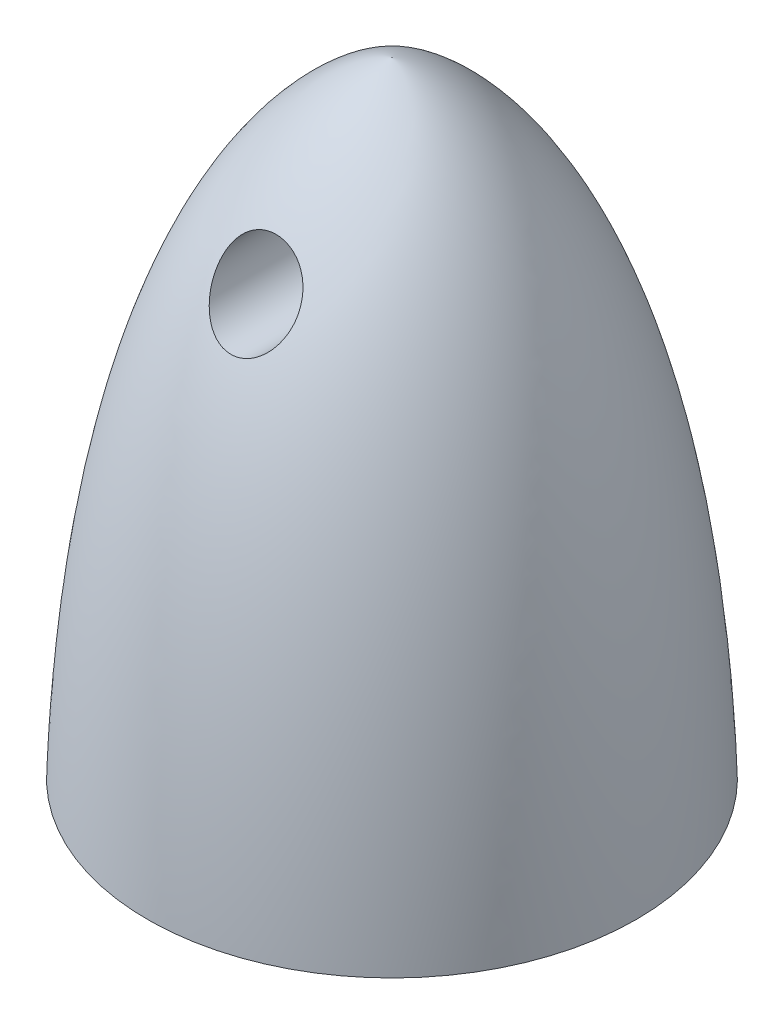
ISO-10303-21;
HEADER;
FILE_DESCRIPTION(('STEP AP214'),'2;1');
FILE_NAME('part.step','',(''),(''),'','','');
FILE_SCHEMA(('AUTOMOTIVE_DESIGN { 1 0 10303 214 1 1 1 1 }'));
ENDSEC;
DATA;
#1=APPLICATION_CONTEXT('core data for automotive mechanical design processes');
#2=APPLICATION_PROTOCOL_DEFINITION('international standard','automotive_design',2000,#1);
#3=PRODUCT_CONTEXT('',#1,'mechanical');
#4=PRODUCT('Part','Part','',(#3));
#5=PRODUCT_RELATED_PRODUCT_CATEGORY('part','',(#4));
#6=PRODUCT_DEFINITION_FORMATION('','',#4);
#7=PRODUCT_DEFINITION_CONTEXT('part definition',#1,'design');
#8=PRODUCT_DEFINITION('design','',#6,#7);
#9=PRODUCT_DEFINITION_SHAPE('','',#8);
#10=(LENGTH_UNIT() NAMED_UNIT(*) SI_UNIT(.MILLI.,.METRE.));
#11=(NAMED_UNIT(*) PLANE_ANGLE_UNIT() SI_UNIT($,.RADIAN.));
#12=(NAMED_UNIT(*) SI_UNIT($,.STERADIAN.) SOLID_ANGLE_UNIT());
#13=UNCERTAINTY_MEASURE_WITH_UNIT(LENGTH_MEASURE(1.E-05),#10,'distance_accuracy_value','');
#14=(GEOMETRIC_REPRESENTATION_CONTEXT(3) GLOBAL_UNCERTAINTY_ASSIGNED_CONTEXT((#13)) GLOBAL_UNIT_ASSIGNED_CONTEXT((#10,
#11,#12)) REPRESENTATION_CONTEXT('',''));
#15=CARTESIAN_POINT('',(0.,0.,0.));
#16=DIRECTION('',(0.,0.,1.));
#17=DIRECTION('',(1.,0.,0.));
#18=AXIS2_PLACEMENT_3D('',#15,#16,#17);
#19=CARTESIAN_POINT('',(3.5,0.,0.));
#20=DIRECTION('',(0.,-1.,0.));
#21=DIRECTION('',(1.,0.,0.));
#22=AXIS2_PLACEMENT_3D('',#19,#20,#21);
#23=PLANE('',#22);
#24=DIRECTION('',(-0.5,0.,0.866025403784439));
#25=VECTOR('',#24,1.);
#26=CARTESIAN_POINT('',(-3.77988654534136,0.,-4.20304445662277));
#27=LINE('',#26,#25);
#28=CARTESIAN_POINT('',(-3.10325769689424,0.,-5.375));
#29=VERTEX_POINT('',#28);
#30=CARTESIAN_POINT('',(-6.20651539378848,0.,0.));
#31=VERTEX_POINT('',#30);
#32=EDGE_CURVE('E222',#29,#31,#27,.T.);
#33=ORIENTED_EDGE('',*,*,#32,.T.);
#34=DIRECTION('',(0.5,0.,0.866025403784439));
#35=VECTOR('',#34,1.);
#36=CARTESIAN_POINT('',(-3.77988654534136,0.,4.20304445662277));
#37=LINE('',#36,#35);
#38=CARTESIAN_POINT('',(-3.10325769689424,0.,5.375));
#39=VERTEX_POINT('',#38);
#40=EDGE_CURVE('E227',#31,#39,#37,.T.);
#41=ORIENTED_EDGE('',*,*,#40,.T.);
#42=DIRECTION('',(1.,0.,0.));
#43=VECTOR('',#42,1.);
#44=CARTESIAN_POINT('',(3.5,0.,5.375));
#45=LINE('',#44,#43);
#46=CARTESIAN_POINT('',(3.10325769689424,0.,5.375));
#47=VERTEX_POINT('',#46);
#48=EDGE_CURVE('E324',#39,#47,#45,.T.);
#49=ORIENTED_EDGE('',*,*,#48,.T.);
#50=DIRECTION('',(0.5,0.,-0.866025403784439));
#51=VECTOR('',#50,1.);
#52=CARTESIAN_POINT('',(5.52988654534136,0.,1.17195554337723));
#53=LINE('',#52,#51);
#54=CARTESIAN_POINT('',(6.20651539378848,0.,0.));
#55=VERTEX_POINT('',#54);
#56=EDGE_CURVE('E326',#47,#55,#53,.T.);
#57=ORIENTED_EDGE('',*,*,#56,.T.);
#58=DIRECTION('',(-0.5,0.,-0.866025403784438));
#59=VECTOR('',#58,1.);
#60=CARTESIAN_POINT('',(5.52988654534136,0.,-1.17195554337724));
#61=LINE('',#60,#59);
#62=CARTESIAN_POINT('',(3.10325769689424,0.,-5.375));
#63=VERTEX_POINT('',#62);
#64=EDGE_CURVE('E140',#55,#63,#61,.T.);
#65=ORIENTED_EDGE('',*,*,#64,.T.);
#66=DIRECTION('',(-1.,0.,0.));
#67=VECTOR('',#66,1.);
#68=CARTESIAN_POINT('',(3.5,0.,-5.375));
#69=LINE('',#68,#67);
#70=EDGE_CURVE('E229',#63,#29,#69,.T.);
#71=ORIENTED_EDGE('',*,*,#70,.T.);
#72=EDGE_LOOP('',(#33,#41,#49,#57,#65,#71));
#73=FACE_BOUND('',#72,.T.);
#74=CARTESIAN_POINT('',(0.,0.,0.));
#75=DIRECTION('',(0.,-1.,0.));
#76=DIRECTION('',(1.,0.,0.));
#77=AXIS2_PLACEMENT_3D('',#74,#75,#76);
#78=CIRCLE('',#77,9.);
#79=CARTESIAN_POINT('',(9.,0.,0.));
#80=VERTEX_POINT('',#79);
#81=EDGE_CURVE('E136',#80,#80,#78,.T.);
#82=ORIENTED_EDGE('',*,*,#81,.T.);
#83=EDGE_LOOP('',(#82));
#84=FACE_BOUND('',#83,.T.);
#85=ADVANCED_FACE('F43',(#73,#84),#23,.T.);
#86=CARTESIAN_POINT('',(9.,0.,0.));
#87=CARTESIAN_POINT('',(8.26210854238125,21.480183495043,0.));
#88=CARTESIAN_POINT('',(0.03733616643493,22.9839757529889,0.));
#89=CARTESIAN_POINT('',(0.,23.,0.));
#90=B_SPLINE_CURVE_WITH_KNOTS('',3,(#86,#87,#88,#89),.UNSPECIFIED.,.F.,.F.,(4,4),(0.,1.),.UNSPECIFIED.);
#91=CARTESIAN_POINT('',(0.,0.,0.));
#92=DIRECTION('',(0.,-1.,0.));
#93=AXIS1_PLACEMENT('',#91,#92);
#94=SURFACE_OF_REVOLUTION('',#90,#93);
#95=CARTESIAN_POINT('',(1.5,18.,-4.97432438544955));
#96=CARTESIAN_POINT('',(1.49999818765798,17.8889484123771,-5.03768109679077));
#97=CARTESIAN_POINT('',(1.48766396124527,17.7786584403752,-5.10267158838565));
#98=CARTESIAN_POINT('',(1.43927247130889,17.5632813244684,-5.23291358120424));
#99=CARTESIAN_POINT('',(1.40315687440887,17.4582076589338,-5.29816533109238));
#100=CARTESIAN_POINT('',(1.31342949340917,17.2688706439223,-5.41810477394586));
#101=CARTESIAN_POINT('',(1.2623717438864,17.1836126976006,-5.47313293291442));
#102=CARTESIAN_POINT('',(1.14264456734388,17.0230951596866,-5.57816043244573));
#103=CARTESIAN_POINT('',(1.07402014836341,16.9478107517764,-5.62817217656369));
#104=CARTESIAN_POINT('',(0.940055138824794,16.8286290949595,-5.70814172112544));
#105=CARTESIAN_POINT('',(0.878521939408809,16.7816657497753,-5.73992866177036));
#106=CARTESIAN_POINT('',(0.746947902236184,16.6968569442813,-5.79765918177381));
#107=CARTESIAN_POINT('',(0.676910886736367,16.6590074101908,-5.82360537154954));
#108=CARTESIAN_POINT('',(0.529129225688246,16.594091146149,-5.86827731136745));
#109=CARTESIAN_POINT('',(0.451330938230837,16.5671070315612,-5.88694770655099));
#110=CARTESIAN_POINT('',(0.290826195225859,16.5261417194271,-5.9153463414199));
#111=CARTESIAN_POINT('',(0.208124304615665,16.51214862416,-5.92508276311791));
#112=CARTESIAN_POINT('',(0.0517981958705598,16.4991134882695,-5.93415337527413));
#113=CARTESIAN_POINT('',(-0.0216210473040325,16.498375849643,-5.93466727048152));
#114=CARTESIAN_POINT('',(-0.167442341713142,16.5075875712215,-5.92825617602529));
#115=CARTESIAN_POINT('',(-0.239844631860297,16.5175343773026,-5.92133296420721));
#116=CARTESIAN_POINT('',(-0.378083806681238,16.5467926943885,-5.90102413607461));
#117=CARTESIAN_POINT('',(-0.444069199988726,16.565637256118,-5.8879608857563));
#118=CARTESIAN_POINT('',(-0.571670700787983,16.6115498816374,-5.85625383561255));
#119=CARTESIAN_POINT('',(-0.633285907178379,16.6386196353582,-5.83760888899493));
#120=CARTESIAN_POINT('',(-0.755829626912085,16.7023604946537,-5.79392250705925));
#121=CARTESIAN_POINT('',(-0.816305275635695,16.7396282503857,-5.76848752213393));
#122=CARTESIAN_POINT('',(-0.930218421033779,16.8211802810988,-5.71320218571157));
#123=CARTESIAN_POINT('',(-0.983641365781501,16.8654786604238,-5.68334296679908));
#124=CARTESIAN_POINT('',(-1.09075358066201,16.967264448747,-5.61528918439091));
#125=CARTESIAN_POINT('',(-1.14314908992821,17.0257297523088,-5.5765231874501));
#126=CARTESIAN_POINT('',(-1.23738559260275,17.1486047197193,-5.4959722716323));
#127=CARTESIAN_POINT('',(-1.27923328069909,17.2130105774638,-5.45418928940935));
#128=CARTESIAN_POINT('',(-1.35850547656145,17.3578285188574,-5.36149582970196));
#129=CARTESIAN_POINT('',(-1.39396626024272,17.4390995773133,-5.31024185620041));
#130=CARTESIAN_POINT('',(-1.45004779418952,17.6061313049978,-5.20688258809358));
#131=CARTESIAN_POINT('',(-1.47065853880184,17.6918949595862,-5.1547767436454));
#132=CARTESIAN_POINT('',(-1.49792694679084,17.8750009683714,-5.04601540395226));
#133=CARTESIAN_POINT('',(-1.50295900139653,17.9726359534677,-4.98943394204479));
#134=CARTESIAN_POINT('',(-1.49371048435647,18.1686863464758,-4.87915115511317));
#135=CARTESIAN_POINT('',(-1.47942845024211,18.2671018129249,-4.82545004851049));
#136=CARTESIAN_POINT('',(-1.43140473981415,18.4588858260527,-4.72438509161453));
#137=CARTESIAN_POINT('',(-1.39821166660934,18.5523186865132,-4.67688713426131));
#138=CARTESIAN_POINT('',(-1.31241675518344,18.7331748466848,-4.58839750926385));
#139=CARTESIAN_POINT('',(-1.25983691420771,18.820604824727,-4.54739854262293));
#140=CARTESIAN_POINT('',(-1.14371238918059,18.9746985185818,-4.47799958682688));
#141=CARTESIAN_POINT('',(-1.08235852770286,19.0425919842799,-4.44866546532656));
#142=CARTESIAN_POINT('',(-0.946732080470184,19.1671119176249,-4.39669727439109));
#143=CARTESIAN_POINT('',(-0.872469374681451,19.2237469315371,-4.37405811640903));
#144=CARTESIAN_POINT('',(-0.722460121113243,19.3171799088199,-4.33780636561441));
#145=CARTESIAN_POINT('',(-0.647831508396996,19.3554970560627,-4.32346242261404));
#146=CARTESIAN_POINT('',(-0.492515076734044,19.4193199956224,-4.30003583237776));
#147=CARTESIAN_POINT('',(-0.411829037537309,19.4448295341768,-4.2909516465387));
#148=CARTESIAN_POINT('',(-0.250942029202602,19.4810465328326,-4.27817930467073));
#149=CARTESIAN_POINT('',(-0.170907323983703,19.4924118823465,-4.27425081188215));
#150=CARTESIAN_POINT('',(-0.00996066710764475,19.502130949268,-4.27088658402703));
#151=CARTESIAN_POINT('',(0.0709511869030886,19.5004861004475,-4.27145035389662));
#152=CARTESIAN_POINT('',(0.230431804600732,19.4843370144373,-4.27705563781391));
#153=CARTESIAN_POINT('',(0.309016449372512,19.4699721387295,-4.28204862610587));
#154=CARTESIAN_POINT('',(0.462523597465353,19.4291184007673,-4.29656463462946));
#155=CARTESIAN_POINT('',(0.537446289295772,19.4026301633262,-4.30608742140553));
#156=CARTESIAN_POINT('',(0.681799570828843,19.338435249184,-4.32985179649272));
#157=CARTESIAN_POINT('',(0.751211890386405,19.3006930775697,-4.34410833144931));
#158=CARTESIAN_POINT('',(0.88247607798067,19.2154674145229,-4.37740552364476));
#159=CARTESIAN_POINT('',(0.944328047991357,19.1679840545027,-4.39644611634567));
#160=CARTESIAN_POINT('',(1.06042758580351,19.0638219650027,-4.43971307959332));
#161=CARTESIAN_POINT('',(1.11446428266013,19.0069546887158,-4.46404998671907));
#162=CARTESIAN_POINT('',(1.21222714892399,18.886852848359,-4.51729563032328));
#163=CARTESIAN_POINT('',(1.25594856241621,18.8236153663711,-4.54620646541293));
#164=CARTESIAN_POINT('',(1.3351750092512,18.6883716052172,-4.61010695316331));
#165=CARTESIAN_POINT('',(1.36993487443964,18.6160617239424,-4.64537385559733));
#166=CARTESIAN_POINT('',(1.42711765165393,18.4686028163295,-4.71959963779646));
#167=CARTESIAN_POINT('',(1.449546504969,18.393455175957,-4.75855672894074));
#168=CARTESIAN_POINT('',(1.47738868657758,18.265026532594,-4.82699385813478));
#169=CARTESIAN_POINT('',(1.48589791325271,18.2120147846417,-4.85577144855154));
#170=CARTESIAN_POINT('',(1.49720482102853,18.1059444541449,-4.91435045028042));
#171=CARTESIAN_POINT('',(1.50000086308781,18.0528858625278,-4.94415215290492));
#172=CARTESIAN_POINT('',(1.5,18.,-4.97432438544955));
#173=B_SPLINE_CURVE_WITH_KNOTS('',3,(#95,#96,#97,#98,#99,#100,#101,#102,#103,#104,#105,#106,
#107,#108,#109,#110,#111,#112,#113,#114,#115,#116,#117,#118,#119,#120,#121,#122,#123,#124,#125,
#126,#127,#128,#129,#130,#131,#132,#133,#134,#135,#136,#137,#138,#139,#140,#141,#142,#143,#144,
#145,#146,#147,#148,#149,#150,#151,#152,#153,#154,#155,#156,#157,#158,#159,#160,#161,#162,#163,
#164,#165,#166,#167,#168,#169,#170,#171,#172),.UNSPECIFIED.,.T.,.F.,(4,2,2,2,2,2,2,2,2,2,2,2,2,
2,2,2,2,2,2,2,2,2,2,2,2,2,2,2,2,2,2,2,2,2,2,2,2,2,4),(0.,0.383281974963355,0.767507622904653,
1.10659250043549,1.4448171464435,1.69487223130918,1.94481533574208,2.1966245411819,
2.4482029010202,2.66733273115227,2.88641018980307,3.09508819894463,3.30380911166386,
3.52929865047414,3.7552464055853,4.01692367310362,4.27843443379647,4.58443545764725,
4.89064246642345,5.2278794021635,5.56514187501565,5.89308528525773,6.22065773304941,
6.5073018716463,6.79372758138324,7.04775583361931,7.30170973900247,7.54334701553243,
7.78495766311519,8.0239535151427,8.26293705119868,8.50268246109968,8.742424636958,
8.98775531000946,9.23319887396395,9.49505933749515,9.75679352142503,9.93927074203481,
10.1218003057377),.UNSPECIFIED.);
#174=CARTESIAN_POINT('',(1.5,18.,-4.97432438544955));
#175=VERTEX_POINT('',#174);
#176=EDGE_CURVE('E133',#175,#175,#173,.T.);
#177=ORIENTED_EDGE('',*,*,#176,.F.);
#178=EDGE_LOOP('',(#177));
#179=FACE_BOUND('',#178,.T.);
#180=CARTESIAN_POINT('',(1.5,18.,4.97432438544955));
#181=CARTESIAN_POINT('',(1.49999937921553,18.0893361561464,4.9233593530599));
#182=CARTESIAN_POINT('',(1.49202183957864,18.1792623582522,4.87339505697908));
#183=CARTESIAN_POINT('',(1.45946536492063,18.3580674124766,4.77701815997591));
#184=CARTESIAN_POINT('',(1.4348875676207,18.4469463359471,4.73060531589266));
#185=CARTESIAN_POINT('',(1.36845175855207,18.6213648816499,4.64260909208423));
#186=CARTESIAN_POINT('',(1.32649319105675,18.7068818480117,4.60105565035489));
#187=CARTESIAN_POINT('',(1.22539846856483,18.8704098159911,4.5245413621911));
#188=CARTESIAN_POINT('',(1.1662763173588,18.9484268679956,4.48957517940194));
#189=CARTESIAN_POINT('',(1.03956849122545,19.0848875567575,4.43070367963714));
#190=CARTESIAN_POINT('',(0.973658652726768,19.1445434121269,4.40600021754626));
#191=CARTESIAN_POINT('',(0.83098167614686,19.2519693250899,4.36289272365452));
#192=CARTESIAN_POINT('',(0.754220740856677,19.2997461303323,4.34448511338285));
#193=CARTESIAN_POINT('',(0.600045732973099,19.3771987121094,4.31537972966677));
#194=CARTESIAN_POINT('',(0.523380182612427,19.4081591580108,4.30411739693255));
#195=CARTESIAN_POINT('',(0.365482884361267,19.4571370658977,4.28655700511506));
#196=CARTESIAN_POINT('',(0.284252179754298,19.4751574722306,4.28025781669742));
#197=CARTESIAN_POINT('',(0.122569369133366,19.4971319196739,4.27260554278511));
#198=CARTESIAN_POINT('',(0.0421878728483486,19.5015518851469,4.27108858129858));
#199=CARTESIAN_POINT('',(-0.118205919571772,19.4974848363519,4.27249444683441));
#200=CARTESIAN_POINT('',(-0.198218246290595,19.4889989112496,4.2754168992017));
#201=CARTESIAN_POINT('',(-0.355100480809251,19.4595326917814,4.28574752178486));
#202=CARTESIAN_POINT('',(-0.431986481220185,19.4386283547455,4.29312842641569));
#203=CARTESIAN_POINT('',(-0.580974438669781,19.3851829305214,4.31250004614925));
#204=CARTESIAN_POINT('',(-0.653076632255545,19.3526424192217,4.32449053312035));
#205=CARTESIAN_POINT('',(-0.791043247924692,19.2769047013815,4.35330418010647));
#206=CARTESIAN_POINT('',(-0.856861666268468,19.2336361763096,4.37015981138094));
#207=CARTESIAN_POINT('',(-0.980089381789308,19.1382008432787,4.4086611578644));
#208=CARTESIAN_POINT('',(-1.03749802083036,19.0860333395905,4.43030724763462));
#209=CARTESIAN_POINT('',(-1.14447955813093,18.9728450265246,4.47895597552005));
#210=CARTESIAN_POINT('',(-1.19373583837477,18.9115909650016,4.50611028745118));
#211=CARTESIAN_POINT('',(-1.2813609482267,18.783665918487,4.56481737854361));
#212=CARTESIAN_POINT('',(-1.31972635191575,18.716993237437,4.59637153711065));
#213=CARTESIAN_POINT('',(-1.38797945183004,18.5746593984572,4.66589966293167));
#214=CARTESIAN_POINT('',(-1.41693757583357,18.4987065456576,4.70418580840606));
#215=CARTESIAN_POINT('',(-1.46203352069575,18.3448131235381,4.7841376450549));
#216=CARTESIAN_POINT('',(-1.47816527693139,18.2668716318949,4.82580492466403));
#217=CARTESIAN_POINT('',(-1.49918085381348,18.1012338869521,4.91669454311373));
#218=CARTESIAN_POINT('',(-1.50246183885059,18.013501854532,4.9662200451749));
#219=CARTESIAN_POINT('',(-1.49393979249053,17.8396061191375,5.0668229399344));
#220=CARTESIAN_POINT('',(-1.48212770998407,17.7534433886909,5.11790124589028));
#221=CARTESIAN_POINT('',(-1.45245863445874,17.6222988506034,5.19723526392746));
#222=CARTESIAN_POINT('',(-1.43966027160681,17.5761174789687,5.22549172787559));
#223=CARTESIAN_POINT('',(-1.40967286850171,17.4851063712434,5.28174222310076));
#224=CARTESIAN_POINT('',(-1.39248802829329,17.4402753878115,5.3097364790073));
#225=CARTESIAN_POINT('',(-1.33436075753151,17.3080784128404,5.393037706134));
#226=CARTESIAN_POINT('',(-1.2868544704051,17.2230478697708,5.4476391176538));
#227=CARTESIAN_POINT('',(-1.17446873228304,17.0617588222695,5.55267391743939));
#228=CARTESIAN_POINT('',(-1.10954068333471,16.985525722216,5.60309512200592));
#229=CARTESIAN_POINT('',(-0.9998441604861,16.8806844193226,5.67316920371596));
#230=CARTESIAN_POINT('',(-0.961263206083318,16.8473446187066,5.6955854358073));
#231=CARTESIAN_POINT('',(-0.880079864897602,16.7842264300358,5.73821977806804));
#232=CARTESIAN_POINT('',(-0.837473437911493,16.7544516895022,5.75843563507617));
#233=CARTESIAN_POINT('',(-0.731627402759379,16.6885357415161,5.80336093021187));
#234=CARTESIAN_POINT('',(-0.666686817531166,16.6542570837585,5.8268705673886));
#235=CARTESIAN_POINT('',(-0.530879963632004,16.5951368328148,5.86756173363309));
#236=CARTESIAN_POINT('',(-0.460022310869865,16.5702818003823,5.88475227343435));
#237=CARTESIAN_POINT('',(-0.313614987999085,16.5311865983269,5.91184455448044));
#238=CARTESIAN_POINT('',(-0.238041152237368,16.5170069657968,5.9217047234271));
#239=CARTESIAN_POINT('',(-0.0849954984694758,16.500435855076,5.93323149972567));
#240=CARTESIAN_POINT('',(-0.00752433870190808,16.4980403452476,5.93490090933698));
#241=CARTESIAN_POINT('',(0.139675239941037,16.5048640499732,5.93015163659015));
#242=CARTESIAN_POINT('',(0.209477404929231,16.5130653788965,5.92444176450738));
#243=CARTESIAN_POINT('',(0.346432239877763,16.5388904445638,5.90650530113236));
#244=CARTESIAN_POINT('',(0.413584859277825,16.5565143610222,5.89427858554618));
#245=CARTESIAN_POINT('',(0.544423150887746,16.6005608338859,5.86383184062227));
#246=CARTESIAN_POINT('',(0.608056426866899,16.6270882817578,5.84554039617463));
#247=CARTESIAN_POINT('',(0.729794677466787,16.6877386463826,5.80392501786198));
#248=CARTESIAN_POINT('',(0.787897746017102,16.7218641684922,5.78059935786387));
#249=CARTESIAN_POINT('',(0.904494983698832,16.8010665786203,5.72679238033492));
#250=CARTESIAN_POINT('',(0.962182384587121,16.8469696179958,5.69578636480479));
#251=CARTESIAN_POINT('',(1.06914339990126,16.9453810513595,5.62987172760021));
#252=CARTESIAN_POINT('',(1.11840849476545,16.99789604152,5.59495921267401));
#253=CARTESIAN_POINT('',(1.18959811721749,17.0853442668497,5.53740279349814));
#254=CARTESIAN_POINT('',(1.21440479665624,17.1185689744021,5.51565488715442));
#255=CARTESIAN_POINT('',(1.2609626493937,17.186569376719,5.47142572234362));
#256=CARTESIAN_POINT('',(1.28271669846097,17.2213435705144,5.44894517901071));
#257=CARTESIAN_POINT('',(1.34342942447709,17.3277856795842,5.38061203216246));
#258=CARTESIAN_POINT('',(1.3778191316465,17.4015488494897,5.33388395919451));
#259=CARTESIAN_POINT('',(1.4370113276116,17.5607625742429,5.23470643939278));
#260=CARTESIAN_POINT('',(1.46048927089479,17.6466400351037,5.18215703135293));
#261=CARTESIAN_POINT('',(1.49198496742562,17.8214804001492,5.07751127773652));
#262=CARTESIAN_POINT('',(1.50000062231407,17.910443721443,5.02541499460756));
#263=CARTESIAN_POINT('',(1.5,18.,4.97432438544955));
#264=B_SPLINE_CURVE_WITH_KNOTS('',3,(#180,#181,#182,#183,#184,#185,#186,#187,#188,#189,#190,
#191,#192,#193,#194,#195,#196,#197,#198,#199,#200,#201,#202,#203,#204,#205,#206,#207,#208,#209,
#210,#211,#212,#213,#214,#215,#216,#217,#218,#219,#220,#221,#222,#223,#224,#225,#226,#227,#228,
#229,#230,#231,#232,#233,#234,#235,#236,#237,#238,#239,#240,#241,#242,#243,#244,#245,#246,#247,
#248,#249,#250,#251,#252,#253,#254,#255,#256,#257,#258,#259,#260,#261,#262,#263),.UNSPECIFIED.,
.T.,.F.,(4,2,2,2,2,2,2,2,2,2,2,2,2,2,2,2,2,2,2,2,2,2,2,2,2,2,2,2,2,2,2,2,2,2,2,2,2,2,2,2,2,4),
(0.,0.308232818628144,0.616444514244857,0.926464827395804,1.23623290206751,1.51150288841495,
1.78661615427191,2.03570752040551,2.28474219087819,2.52514469132546,2.76552690463228,
3.00445374094471,3.24336875411315,3.48391675658894,3.72448357392514,3.97289621971662,
4.22138692175283,4.48985567283085,4.75845128719403,5.05964709482578,5.36102361032541,
5.52775026777774,5.69431787968561,6.02759250814657,6.36180664801095,6.52865052918141,
6.69566368057524,6.92596004461039,7.15592673121527,7.38718786826808,7.61836987970133,
7.8289116005177,8.03945733708079,8.25257603910989,8.46576793175702,8.70480908140885,
8.94409061988371,9.08443431416938,9.22464489533642,9.50517019742925,9.81412057109508,
10.1231128689082),.UNSPECIFIED.);
#265=CARTESIAN_POINT('',(1.5,18.,4.97432438544955));
#266=VERTEX_POINT('',#265);
#267=EDGE_CURVE('E164',#266,#266,#264,.T.);
#268=ORIENTED_EDGE('',*,*,#267,.F.);
#269=EDGE_LOOP('',(#268));
#270=FACE_BOUND('',#269,.T.);
#271=CARTESIAN_POINT('',(0.,23.,0.));
#272=VERTEX_POINT('',#271);
#273=VERTEX_LOOP('',#272);
#274=FACE_BOUND('',#273,.T.);
#275=ORIENTED_EDGE('',*,*,#81,.F.);
#276=EDGE_LOOP('',(#275));
#277=FACE_BOUND('',#276,.T.);
#278=ADVANCED_FACE('F154',(#179,#270,#274,#277),#94,.F.);
#279=CARTESIAN_POINT('',(2.81458256229943,7.,4.875));
#280=DIRECTION('',(-0.866025403784439,0.,-0.5));
#281=DIRECTION('',(-0.5,0.,0.866025403784439));
#282=AXIS2_PLACEMENT_3D('',#279,#280,#281);
#283=PLANE('',#282);
#284=DIRECTION('',(0.,-1.,0.));
#285=VECTOR('',#284,1.);
#286=CARTESIAN_POINT('',(5.62916512459885,7.,0.));
#287=LINE('',#286,#285);
#288=CARTESIAN_POINT('',(5.62916512459885,7.,0.));
#289=VERTEX_POINT('',#288);
#290=CARTESIAN_POINT('',(5.62916512459885,0.500000000000004,0.));
#291=VERTEX_POINT('',#290);
#292=EDGE_CURVE('E130',#289,#291,#287,.T.);
#293=ORIENTED_EDGE('',*,*,#292,.T.);
#294=DIRECTION('',(-0.5,0.,0.866025403784439));
#295=VECTOR('',#294,1.);
#296=CARTESIAN_POINT('',(2.81458256229943,0.500000000000005,4.875));
#297=LINE('',#296,#295);
#298=CARTESIAN_POINT('',(2.81458256229943,0.500000000000005,4.875));
#299=VERTEX_POINT('',#298);
#300=EDGE_CURVE('E65',#291,#299,#297,.T.);
#301=ORIENTED_EDGE('',*,*,#300,.T.);
#302=DIRECTION('',(0.,-1.,0.));
#303=VECTOR('',#302,1.);
#304=CARTESIAN_POINT('',(2.81458256229943,7.,4.875));
#305=LINE('',#304,#303);
#306=CARTESIAN_POINT('',(2.81458256229943,7.,4.875));
#307=VERTEX_POINT('',#306);
#308=EDGE_CURVE('E132',#307,#299,#305,.T.);
#309=ORIENTED_EDGE('',*,*,#308,.F.);
#310=DIRECTION('',(0.5,0.,-0.866025403784439));
#311=VECTOR('',#310,1.);
#312=CARTESIAN_POINT('',(2.81458256229943,7.,4.875));
#313=LINE('',#312,#311);
#314=EDGE_CURVE('E124',#307,#289,#313,.T.);
#315=ORIENTED_EDGE('',*,*,#314,.T.);
#316=EDGE_LOOP('',(#293,#301,#309,#315));
#317=FACE_BOUND('',#316,.T.);
#318=ADVANCED_FACE('F129',(#317),#283,.T.);
#319=CARTESIAN_POINT('',(5.62916512459885,7.,0.));
#320=DIRECTION('',(-0.866025403784438,0.,0.5));
#321=DIRECTION('',(0.5,0.,0.866025403784438));
#322=AXIS2_PLACEMENT_3D('',#319,#320,#321);
#323=PLANE('',#322);
#324=DIRECTION('',(0.,-1.,0.));
#325=VECTOR('',#324,1.);
#326=CARTESIAN_POINT('',(2.81458256229943,7.,-4.875));
#327=LINE('',#326,#325);
#328=CARTESIAN_POINT('',(2.81458256229943,7.,-4.875));
#329=VERTEX_POINT('',#328);
#330=CARTESIAN_POINT('',(2.81458256229943,0.500000000000005,-4.875));
#331=VERTEX_POINT('',#330);
#332=EDGE_CURVE('E137',#329,#331,#327,.T.);
#333=ORIENTED_EDGE('',*,*,#332,.T.);
#334=DIRECTION('',(0.5,0.,0.866025403784438));
#335=VECTOR('',#334,1.);
#336=CARTESIAN_POINT('',(5.62916512459885,0.500000000000004,0.));
#337=LINE('',#336,#335);
#338=EDGE_CURVE('E58',#331,#291,#337,.T.);
#339=ORIENTED_EDGE('',*,*,#338,.T.);
#340=ORIENTED_EDGE('',*,*,#292,.F.);
#341=DIRECTION('',(-0.5,0.,-0.866025403784438));
#342=VECTOR('',#341,1.);
#343=CARTESIAN_POINT('',(5.62916512459885,7.,0.));
#344=LINE('',#343,#342);
#345=EDGE_CURVE('E120',#289,#329,#344,.T.);
#346=ORIENTED_EDGE('',*,*,#345,.T.);
#347=EDGE_LOOP('',(#333,#339,#340,#346));
#348=FACE_BOUND('',#347,.T.);
#349=ADVANCED_FACE('F135',(#348),#323,.T.);
#350=CARTESIAN_POINT('',(2.81458256229943,7.,-4.875));
#351=DIRECTION('',(0.,0.,1.));
#352=DIRECTION('',(1.,0.,0.));
#353=AXIS2_PLACEMENT_3D('',#350,#351,#352);
#354=PLANE('',#353);
#355=DIRECTION('',(0.,-1.,0.));
#356=VECTOR('',#355,1.);
#357=CARTESIAN_POINT('',(-2.81458256229943,7.,-4.875));
#358=LINE('',#357,#356);
#359=CARTESIAN_POINT('',(-2.81458256229943,7.,-4.875));
#360=VERTEX_POINT('',#359);
#361=CARTESIAN_POINT('',(-2.81458256229943,0.500000000000005,-4.875));
#362=VERTEX_POINT('',#361);
#363=EDGE_CURVE('E142',#360,#362,#358,.T.);
#364=ORIENTED_EDGE('',*,*,#363,.T.);
#365=DIRECTION('',(1.,0.,0.));
#366=VECTOR('',#365,1.);
#367=CARTESIAN_POINT('',(2.81458256229942,0.500000000000004,-4.875));
#368=LINE('',#367,#366);
#369=EDGE_CURVE('E253',#362,#331,#368,.T.);
#370=ORIENTED_EDGE('',*,*,#369,.T.);
#371=ORIENTED_EDGE('',*,*,#332,.F.);
#372=DIRECTION('',(-1.,0.,0.));
#373=VECTOR('',#372,1.);
#374=CARTESIAN_POINT('',(2.81458256229943,7.,-4.875));
#375=LINE('',#374,#373);
#376=EDGE_CURVE('E126',#329,#360,#375,.T.);
#377=ORIENTED_EDGE('',*,*,#376,.T.);
#378=EDGE_LOOP('',(#364,#370,#371,#377));
#379=FACE_BOUND('',#378,.T.);
#380=ADVANCED_FACE('F198',(#379),#354,.T.);
#381=CARTESIAN_POINT('',(-2.81458256229943,7.,-4.875));
#382=DIRECTION('',(0.866025403784439,0.,0.5));
#383=DIRECTION('',(0.5,0.,-0.866025403784439));
#384=AXIS2_PLACEMENT_3D('',#381,#382,#383);
#385=PLANE('',#384);
#386=DIRECTION('',(0.,-1.,0.));
#387=VECTOR('',#386,1.);
#388=CARTESIAN_POINT('',(-5.62916512459885,7.,0.));
#389=LINE('',#388,#387);
#390=CARTESIAN_POINT('',(-5.62916512459885,7.,0.));
#391=VERTEX_POINT('',#390);
#392=CARTESIAN_POINT('',(-5.62916512459885,0.500000000000005,0.));
#393=VERTEX_POINT('',#392);
#394=EDGE_CURVE('E333',#391,#393,#389,.T.);
#395=ORIENTED_EDGE('',*,*,#394,.T.);
#396=DIRECTION('',(0.5,0.,-0.866025403784439));
#397=VECTOR('',#396,1.);
#398=CARTESIAN_POINT('',(-2.81458256229943,0.500000000000005,-4.875));
#399=LINE('',#398,#397);
#400=EDGE_CURVE('E237',#393,#362,#399,.T.);
#401=ORIENTED_EDGE('',*,*,#400,.T.);
#402=ORIENTED_EDGE('',*,*,#363,.F.);
#403=DIRECTION('',(-0.5,0.,0.866025403784439));
#404=VECTOR('',#403,1.);
#405=CARTESIAN_POINT('',(-2.81458256229943,7.,-4.875));
#406=LINE('',#405,#404);
#407=EDGE_CURVE('E345',#360,#391,#406,.T.);
#408=ORIENTED_EDGE('',*,*,#407,.T.);
#409=EDGE_LOOP('',(#395,#401,#402,#408));
#410=FACE_BOUND('',#409,.T.);
#411=ADVANCED_FACE('F194',(#410),#385,.T.);
#412=CARTESIAN_POINT('',(-5.62916512459885,7.,0.));
#413=DIRECTION('',(0.866025403784439,0.,-0.5));
#414=DIRECTION('',(-0.5,0.,-0.866025403784439));
#415=AXIS2_PLACEMENT_3D('',#412,#413,#414);
#416=PLANE('',#415);
#417=DIRECTION('',(0.,-1.,0.));
#418=VECTOR('',#417,1.);
#419=CARTESIAN_POINT('',(-2.81458256229942,7.,4.875));
#420=LINE('',#419,#418);
#421=CARTESIAN_POINT('',(-2.81458256229942,7.,4.875));
#422=VERTEX_POINT('',#421);
#423=CARTESIAN_POINT('',(-2.81458256229942,0.500000000000005,4.875));
#424=VERTEX_POINT('',#423);
#425=EDGE_CURVE('E335',#422,#424,#420,.T.);
#426=ORIENTED_EDGE('',*,*,#425,.T.);
#427=DIRECTION('',(-0.5,0.,-0.866025403784439));
#428=VECTOR('',#427,1.);
#429=CARTESIAN_POINT('',(-5.62916512459885,0.500000000000006,0.));
#430=LINE('',#429,#428);
#431=EDGE_CURVE('E247',#424,#393,#430,.T.);
#432=ORIENTED_EDGE('',*,*,#431,.T.);
#433=ORIENTED_EDGE('',*,*,#394,.F.);
#434=DIRECTION('',(0.5,0.,0.866025403784439));
#435=VECTOR('',#434,1.);
#436=CARTESIAN_POINT('',(-5.62916512459885,7.,0.));
#437=LINE('',#436,#435);
#438=EDGE_CURVE('E343',#391,#422,#437,.T.);
#439=ORIENTED_EDGE('',*,*,#438,.T.);
#440=EDGE_LOOP('',(#426,#432,#433,#439));
#441=FACE_BOUND('',#440,.T.);
#442=ADVANCED_FACE('F190',(#441),#416,.T.);
#443=CARTESIAN_POINT('',(-2.81458256229942,7.,4.875));
#444=DIRECTION('',(0.,0.,-1.));
#445=DIRECTION('',(-1.,0.,0.));
#446=AXIS2_PLACEMENT_3D('',#443,#444,#445);
#447=PLANE('',#446);
#448=ORIENTED_EDGE('',*,*,#308,.T.);
#449=DIRECTION('',(-1.,0.,0.));
#450=VECTOR('',#449,1.);
#451=CARTESIAN_POINT('',(-2.81458256229943,0.500000000000005,4.875));
#452=LINE('',#451,#450);
#453=EDGE_CURVE('E255',#299,#424,#452,.T.);
#454=ORIENTED_EDGE('',*,*,#453,.T.);
#455=ORIENTED_EDGE('',*,*,#425,.F.);
#456=DIRECTION('',(1.,0.,0.));
#457=VECTOR('',#456,1.);
#458=CARTESIAN_POINT('',(-2.81458256229942,7.,4.875));
#459=LINE('',#458,#457);
#460=EDGE_CURVE('E341',#422,#307,#459,.T.);
#461=ORIENTED_EDGE('',*,*,#460,.T.);
#462=EDGE_LOOP('',(#448,#454,#455,#461));
#463=FACE_BOUND('',#462,.T.);
#464=ADVANCED_FACE('F186',(#463),#447,.T.);
#465=CARTESIAN_POINT('',(0.,7.,0.));
#466=DIRECTION('',(0.,1.,0.));
#467=DIRECTION('',(0.,0.,1.));
#468=AXIS2_PLACEMENT_3D('',#465,#466,#467);
#469=PLANE('',#468);
#470=CARTESIAN_POINT('',(0.,7.,0.));
#471=DIRECTION('',(0.,1.,0.));
#472=DIRECTION('',(0.,0.,1.));
#473=AXIS2_PLACEMENT_3D('',#470,#471,#472);
#474=CIRCLE('',#473,4.);
#475=CARTESIAN_POINT('',(0.,7.,4.));
#476=VERTEX_POINT('',#475);
#477=EDGE_CURVE('E11',#476,#476,#474,.T.);
#478=ORIENTED_EDGE('',*,*,#477,.T.);
#479=EDGE_LOOP('',(#478));
#480=FACE_BOUND('',#479,.T.);
#481=ORIENTED_EDGE('',*,*,#314,.F.);
#482=ORIENTED_EDGE('',*,*,#460,.F.);
#483=ORIENTED_EDGE('',*,*,#438,.F.);
#484=ORIENTED_EDGE('',*,*,#407,.F.);
#485=ORIENTED_EDGE('',*,*,#376,.F.);
#486=ORIENTED_EDGE('',*,*,#345,.F.);
#487=EDGE_LOOP('',(#481,#482,#483,#484,#485,#486));
#488=FACE_BOUND('',#487,.T.);
#489=ADVANCED_FACE('F122',(#480,#488),#469,.F.);
#490=CARTESIAN_POINT('',(3.5,14.,0.));
#491=DIRECTION('',(0.,-1.,0.));
#492=DIRECTION('',(1.,0.,0.));
#493=AXIS2_PLACEMENT_3D('',#490,#491,#492);
#494=PLANE('',#493);
#495=CARTESIAN_POINT('',(0.,14.,0.));
#496=DIRECTION('',(0.,-1.,0.));
#497=DIRECTION('',(1.,0.,0.));
#498=AXIS2_PLACEMENT_3D('',#495,#496,#497);
#499=CIRCLE('',#498,3.);
#500=CARTESIAN_POINT('',(3.,14.,0.));
#501=VERTEX_POINT('',#500);
#502=EDGE_CURVE('E259',#501,#501,#499,.T.);
#503=ORIENTED_EDGE('',*,*,#502,.T.);
#504=EDGE_LOOP('',(#503));
#505=FACE_BOUND('',#504,.T.);
#506=ADVANCED_FACE('F161',(#505),#494,.T.);
#507=CARTESIAN_POINT('',(0.,0.,0.));
#508=DIRECTION('',(0.,-1.,0.));
#509=DIRECTION('',(1.,0.,0.));
#510=AXIS2_PLACEMENT_3D('',#507,#508,#509);
#511=CYLINDRICAL_SURFACE('',#510,3.5);
#512=CARTESIAN_POINT('',(0.,13.5,0.));
#513=DIRECTION('',(0.,-1.,0.));
#514=DIRECTION('',(1.,0.,0.));
#515=AXIS2_PLACEMENT_3D('',#512,#513,#514);
#516=CIRCLE('',#515,3.5);
#517=CARTESIAN_POINT('',(3.5,13.5,0.));
#518=VERTEX_POINT('',#517);
#519=EDGE_CURVE('E51',#518,#518,#516,.F.);
#520=ORIENTED_EDGE('',*,*,#519,.T.);
#521=EDGE_LOOP('',(#520));
#522=FACE_BOUND('',#521,.T.);
#523=CARTESIAN_POINT('',(0.,7.5,0.));
#524=DIRECTION('',(0.,1.,0.));
#525=DIRECTION('',(0.,0.,1.));
#526=AXIS2_PLACEMENT_3D('',#523,#524,#525);
#527=CIRCLE('',#526,3.5);
#528=CARTESIAN_POINT('',(0.,7.5,3.5));
#529=VERTEX_POINT('',#528);
#530=EDGE_CURVE('E273',#529,#529,#527,.F.);
#531=ORIENTED_EDGE('',*,*,#530,.T.);
#532=EDGE_LOOP('',(#531));
#533=FACE_BOUND('',#532,.T.);
#534=ADVANCED_FACE('F181',(#522,#533),#511,.F.);
#535=CARTESIAN_POINT('',(0.,18.,-8.5));
#536=DIRECTION('',(0.,0.,1.));
#537=DIRECTION('',(1.,0.,0.));
#538=AXIS2_PLACEMENT_3D('',#535,#536,#537);
#539=CYLINDRICAL_SURFACE('',#538,1.5);
#540=ORIENTED_EDGE('',*,*,#176,.T.);
#541=EDGE_LOOP('',(#540));
#542=FACE_BOUND('',#541,.T.);
#543=ORIENTED_EDGE('',*,*,#267,.T.);
#544=EDGE_LOOP('',(#543));
#545=FACE_BOUND('',#544,.T.);
#546=ADVANCED_FACE('F176',(#542,#545),#539,.F.);
#547=CARTESIAN_POINT('',(5.52988654534136,0.,-1.17195554337724));
#548=DIRECTION('',(0.612372435695795,0.707106781186547,-0.353553390593274));
#549=DIRECTION('',(-0.5,0.,-0.866025403784438));
#550=AXIS2_PLACEMENT_3D('',#547,#548,#549);
#551=PLANE('',#550);
#552=DIRECTION('',(-0.755928946018454,0.654653670707978,0.));
#553=VECTOR('',#552,1.);
#554=CARTESIAN_POINT('',(5.81987033753298,0.334844440964925,0.));
#555=LINE('',#554,#553);
#556=EDGE_CURVE('E265',#291,#55,#555,.F.);
#557=ORIENTED_EDGE('',*,*,#556,.F.);
#558=ORIENTED_EDGE('',*,*,#338,.F.);
#559=DIRECTION('',(0.377964473009227,-0.654653670707978,-0.654653670707976));
#560=VECTOR('',#559,1.);
#561=CARTESIAN_POINT('',(3.15993516876649,-0.098168260927295,-5.4731682609273));
#562=LINE('',#561,#560);
#563=EDGE_CURVE('E268',#63,#331,#562,.F.);
#564=ORIENTED_EDGE('',*,*,#563,.F.);
#565=ORIENTED_EDGE('',*,*,#64,.F.);
#566=EDGE_LOOP('',(#557,#558,#564,#565));
#567=FACE_BOUND('',#566,.T.);
#568=ADVANCED_FACE('F180',(#567),#551,.F.);
#569=CARTESIAN_POINT('',(3.5,0.,-5.375));
#570=DIRECTION('',(0.,0.707106781186546,-0.707106781186549));
#571=DIRECTION('',(-1.,0.,0.));
#572=AXIS2_PLACEMENT_3D('',#569,#570,#571);
#573=PLANE('',#572);
#574=ORIENTED_EDGE('',*,*,#563,.T.);
#575=ORIENTED_EDGE('',*,*,#369,.F.);
#576=DIRECTION('',(-0.377964473009229,-0.654653670707978,-0.654653670707976));
#577=VECTOR('',#576,1.);
#578=CARTESIAN_POINT('',(-2.90993516876649,0.334844440964923,-5.04015555903508));
#579=LINE('',#578,#577);
#580=EDGE_CURVE('E263',#29,#362,#579,.F.);
#581=ORIENTED_EDGE('',*,*,#580,.F.);
#582=ORIENTED_EDGE('',*,*,#70,.F.);
#583=EDGE_LOOP('',(#574,#575,#581,#582));
#584=FACE_BOUND('',#583,.T.);
#585=ADVANCED_FACE('F293',(#584),#573,.F.);
#586=CARTESIAN_POINT('',(5.52988654534136,0.,1.17195554337723));
#587=DIRECTION('',(0.612372435695796,0.707106781186546,0.353553390593274));
#588=DIRECTION('',(0.5,0.,-0.866025403784439));
#589=AXIS2_PLACEMENT_3D('',#586,#587,#588);
#590=PLANE('',#589);
#591=ORIENTED_EDGE('',*,*,#556,.T.);
#592=ORIENTED_EDGE('',*,*,#56,.F.);
#593=DIRECTION('',(-0.377964473009226,0.654653670707978,-0.654653670707977));
#594=VECTOR('',#593,1.);
#595=CARTESIAN_POINT('',(3.15993516876649,-0.0981682609272942,5.4731682609273));
#596=LINE('',#595,#594);
#597=EDGE_CURVE('E241',#299,#47,#596,.F.);
#598=ORIENTED_EDGE('',*,*,#597,.F.);
#599=ORIENTED_EDGE('',*,*,#300,.F.);
#600=EDGE_LOOP('',(#591,#592,#598,#599));
#601=FACE_BOUND('',#600,.T.);
#602=ADVANCED_FACE('F300',(#601),#590,.F.);
#603=CARTESIAN_POINT('',(-3.77988654534136,0.,-4.20304445662277));
#604=DIRECTION('',(-0.612372435695795,0.707106781186547,-0.353553390593274));
#605=DIRECTION('',(-0.5,0.,0.866025403784439));
#606=AXIS2_PLACEMENT_3D('',#603,#604,#605);
#607=PLANE('',#606);
#608=ORIENTED_EDGE('',*,*,#580,.T.);
#609=ORIENTED_EDGE('',*,*,#400,.F.);
#610=DIRECTION('',(-0.755928946018454,-0.654653670707977,0.));
#611=VECTOR('',#610,1.);
#612=CARTESIAN_POINT('',(-4.81987033753298,1.20086984474937,0.));
#613=LINE('',#612,#611);
#614=EDGE_CURVE('E235',#31,#393,#613,.F.);
#615=ORIENTED_EDGE('',*,*,#614,.F.);
#616=ORIENTED_EDGE('',*,*,#32,.F.);
#617=EDGE_LOOP('',(#608,#609,#615,#616));
#618=FACE_BOUND('',#617,.T.);
#619=ADVANCED_FACE('F236',(#618),#607,.F.);
#620=CARTESIAN_POINT('',(3.5,0.,5.375));
#621=DIRECTION('',(0.,0.707106781186547,0.707106781186548));
#622=DIRECTION('',(1.,0.,0.));
#623=AXIS2_PLACEMENT_3D('',#620,#621,#622);
#624=PLANE('',#623);
#625=ORIENTED_EDGE('',*,*,#597,.T.);
#626=ORIENTED_EDGE('',*,*,#48,.F.);
#627=DIRECTION('',(0.377964473009227,0.654653670707978,-0.654653670707976));
#628=VECTOR('',#627,1.);
#629=CARTESIAN_POINT('',(-2.90993516876649,0.334844440964924,5.04015555903508));
#630=LINE('',#629,#628);
#631=EDGE_CURVE('E242',#424,#39,#630,.F.);
#632=ORIENTED_EDGE('',*,*,#631,.F.);
#633=ORIENTED_EDGE('',*,*,#453,.F.);
#634=EDGE_LOOP('',(#625,#626,#632,#633));
#635=FACE_BOUND('',#634,.T.);
#636=ADVANCED_FACE('F285',(#635),#624,.F.);
#637=CARTESIAN_POINT('',(-3.77988654534136,0.,4.20304445662277));
#638=DIRECTION('',(-0.612372435695795,0.707106781186547,0.353553390593274));
#639=DIRECTION('',(0.5,0.,0.866025403784439));
#640=AXIS2_PLACEMENT_3D('',#637,#638,#639);
#641=PLANE('',#640);
#642=ORIENTED_EDGE('',*,*,#614,.T.);
#643=ORIENTED_EDGE('',*,*,#431,.F.);
#644=ORIENTED_EDGE('',*,*,#631,.T.);
#645=ORIENTED_EDGE('',*,*,#40,.F.);
#646=EDGE_LOOP('',(#642,#643,#644,#645));
#647=FACE_BOUND('',#646,.T.);
#648=ADVANCED_FACE('F244',(#647),#641,.F.);
#649=CARTESIAN_POINT('',(0.,13.5,0.));
#650=DIRECTION('',(0.,-1.,0.));
#651=DIRECTION('',(1.,0.,0.));
#652=AXIS2_PLACEMENT_3D('',#649,#650,#651);
#653=TOROIDAL_SURFACE('',#652,3.,0.5);
#654=ORIENTED_EDGE('',*,*,#519,.F.);
#655=EDGE_LOOP('',(#654));
#656=FACE_BOUND('',#655,.T.);
#657=ORIENTED_EDGE('',*,*,#502,.F.);
#658=EDGE_LOOP('',(#657));
#659=FACE_BOUND('',#658,.T.);
#660=ADVANCED_FACE('F277',(#656,#659),#653,.F.);
#661=CARTESIAN_POINT('',(0.,7.5,0.));
#662=DIRECTION('',(0.,1.,0.));
#663=DIRECTION('',(0.,0.,1.));
#664=AXIS2_PLACEMENT_3D('',#661,#662,#663);
#665=TOROIDAL_SURFACE('',#664,4.,0.5);
#666=ORIENTED_EDGE('',*,*,#530,.F.);
#667=EDGE_LOOP('',(#666));
#668=FACE_BOUND('',#667,.T.);
#669=ORIENTED_EDGE('',*,*,#477,.F.);
#670=EDGE_LOOP('',(#669));
#671=FACE_BOUND('',#670,.T.);
#672=ADVANCED_FACE('F45',(#668,#671),#665,.T.);
#673=CLOSED_SHELL('',(#85,#278,#318,#349,#380,#411,#442,#464,#489,#506,#534,#546,#568,#585,#602,
#619,#636,#648,#660,#672));
#674=MANIFOLD_SOLID_BREP('B2',#673);
#675=ADVANCED_BREP_SHAPE_REPRESENTATION('',(#18,#674),#14);
#676=SHAPE_DEFINITION_REPRESENTATION(#9,#675);
ENDSEC;
END-ISO-10303-21;
